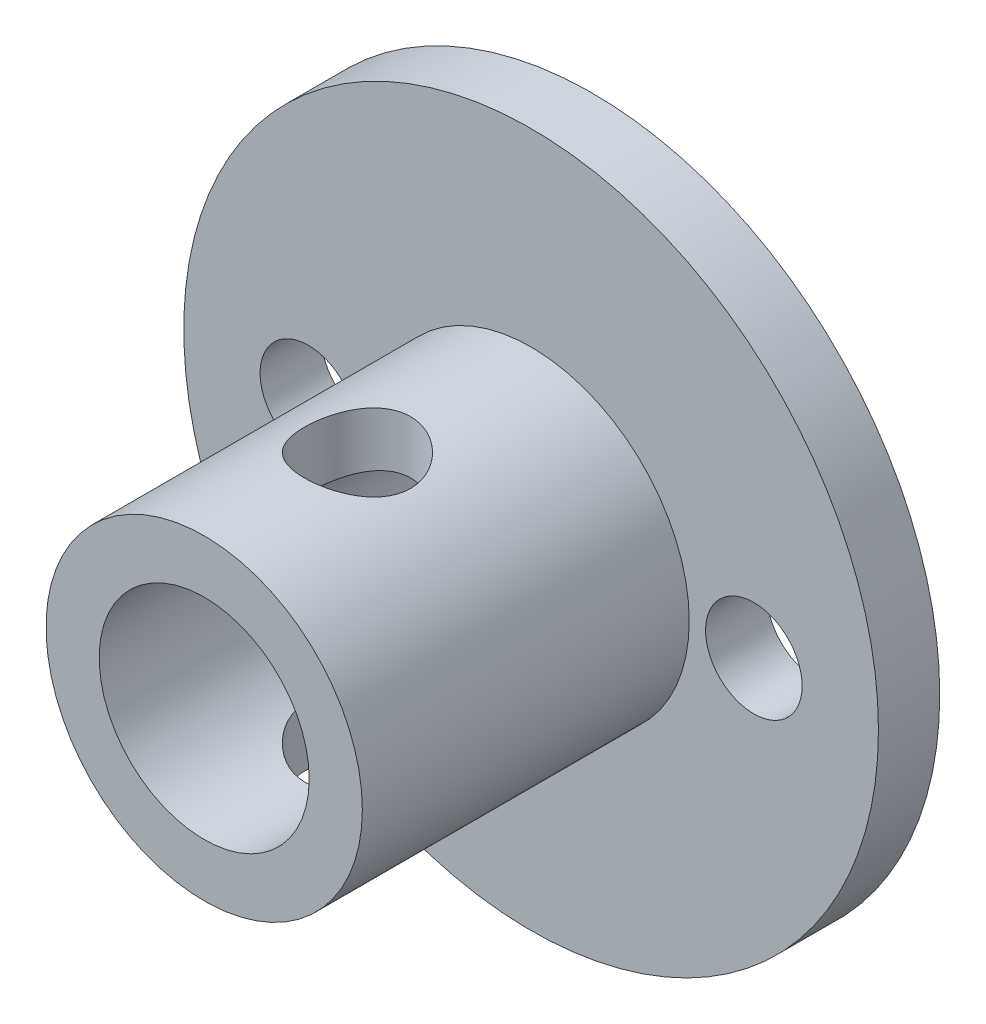
ISO-10303-21;
HEADER;
FILE_DESCRIPTION(('STEP AP214'),'2;1');
FILE_NAME('part.step','',(''),(''),'','','');
FILE_SCHEMA(('AUTOMOTIVE_DESIGN { 1 0 10303 214 1 1 1 1 }'));
ENDSEC;
DATA;
#1=APPLICATION_CONTEXT('core data for automotive mechanical design processes');
#2=APPLICATION_PROTOCOL_DEFINITION('international standard','automotive_design',2000,#1);
#3=PRODUCT_CONTEXT('',#1,'mechanical');
#4=PRODUCT('Part','Part','',(#3));
#5=PRODUCT_RELATED_PRODUCT_CATEGORY('part','',(#4));
#6=PRODUCT_DEFINITION_FORMATION('','',#4);
#7=PRODUCT_DEFINITION_CONTEXT('part definition',#1,'design');
#8=PRODUCT_DEFINITION('design','',#6,#7);
#9=PRODUCT_DEFINITION_SHAPE('','',#8);
#10=(LENGTH_UNIT() NAMED_UNIT(*) SI_UNIT(.MILLI.,.METRE.));
#11=(NAMED_UNIT(*) PLANE_ANGLE_UNIT() SI_UNIT($,.RADIAN.));
#12=(NAMED_UNIT(*) SI_UNIT($,.STERADIAN.) SOLID_ANGLE_UNIT());
#13=UNCERTAINTY_MEASURE_WITH_UNIT(LENGTH_MEASURE(1.E-05),#10,'distance_accuracy_value','');
#14=(GEOMETRIC_REPRESENTATION_CONTEXT(3) GLOBAL_UNCERTAINTY_ASSIGNED_CONTEXT((#13)) GLOBAL_UNIT_ASSIGNED_CONTEXT((#10,
#11,#12)) REPRESENTATION_CONTEXT('',''));
#15=CARTESIAN_POINT('',(0.,0.,0.));
#16=DIRECTION('',(0.,0.,1.));
#17=DIRECTION('',(1.,0.,0.));
#18=AXIS2_PLACEMENT_3D('',#15,#16,#17);
#19=CARTESIAN_POINT('',(0.,0.,0.));
#20=DIRECTION('',(0.,0.,1.));
#21=DIRECTION('',(1.,0.,0.));
#22=AXIS2_PLACEMENT_3D('',#19,#20,#21);
#23=PLANE('',#22);
#24=CARTESIAN_POINT('',(0.,0.,0.));
#25=DIRECTION('',(0.,0.,1.));
#26=DIRECTION('',(1.,0.,0.));
#27=AXIS2_PLACEMENT_3D('',#24,#25,#26);
#28=CIRCLE('',#27,3.2639);
#29=CARTESIAN_POINT('',(3.2639,0.,0.));
#30=VERTEX_POINT('',#29);
#31=EDGE_CURVE('E10',#30,#30,#28,.T.);
#32=ORIENTED_EDGE('',*,*,#31,.T.);
#33=EDGE_LOOP('',(#32));
#34=FACE_BOUND('',#33,.T.);
#35=CARTESIAN_POINT('',(0.,0.,0.));
#36=DIRECTION('',(0.,0.,1.));
#37=DIRECTION('',(1.,0.,0.));
#38=AXIS2_PLACEMENT_3D('',#35,#36,#37);
#39=CIRCLE('',#38,10.795);
#40=CARTESIAN_POINT('',(10.795,0.,0.));
#41=VERTEX_POINT('',#40);
#42=EDGE_CURVE('E57',#41,#41,#39,.T.);
#43=ORIENTED_EDGE('',*,*,#42,.F.);
#44=EDGE_LOOP('',(#43));
#45=FACE_BOUND('',#44,.T.);
#46=CARTESIAN_POINT('',(6.9229,0.,0.));
#47=DIRECTION('',(0.,0.,1.));
#48=DIRECTION('',(1.,0.,0.));
#49=AXIS2_PLACEMENT_3D('',#46,#47,#48);
#50=CIRCLE('',#49,1.5);
#51=CARTESIAN_POINT('',(8.4229,0.,0.));
#52=VERTEX_POINT('',#51);
#53=EDGE_CURVE('E108',#52,#52,#50,.F.);
#54=ORIENTED_EDGE('',*,*,#53,.F.);
#55=EDGE_LOOP('',(#54));
#56=FACE_BOUND('',#55,.T.);
#57=CARTESIAN_POINT('',(-6.9229,0.,0.));
#58=DIRECTION('',(0.,0.,1.));
#59=DIRECTION('',(1.,0.,0.));
#60=AXIS2_PLACEMENT_3D('',#57,#58,#59);
#61=CIRCLE('',#60,1.5);
#62=CARTESIAN_POINT('',(-5.4229,0.,0.));
#63=VERTEX_POINT('',#62);
#64=EDGE_CURVE('E157',#63,#63,#61,.T.);
#65=ORIENTED_EDGE('',*,*,#64,.T.);
#66=EDGE_LOOP('',(#65));
#67=FACE_BOUND('',#66,.T.);
#68=ADVANCED_FACE('F47',(#34,#45,#56,#67),#23,.F.);
#69=CARTESIAN_POINT('',(0.,0.,1.905));
#70=DIRECTION('',(0.,0.,1.));
#71=DIRECTION('',(1.,0.,0.));
#72=AXIS2_PLACEMENT_3D('',#69,#70,#71);
#73=PLANE('',#72);
#74=CARTESIAN_POINT('',(6.9229,0.,1.905));
#75=DIRECTION('',(0.,0.,1.));
#76=DIRECTION('',(1.,0.,0.));
#77=AXIS2_PLACEMENT_3D('',#74,#75,#76);
#78=CIRCLE('',#77,1.5);
#79=CARTESIAN_POINT('',(8.4229,0.,1.905));
#80=VERTEX_POINT('',#79);
#81=EDGE_CURVE('E160',#80,#80,#78,.F.);
#82=ORIENTED_EDGE('',*,*,#81,.T.);
#83=EDGE_LOOP('',(#82));
#84=FACE_BOUND('',#83,.T.);
#85=CARTESIAN_POINT('',(0.,0.,1.905));
#86=DIRECTION('',(0.,0.,1.));
#87=DIRECTION('',(1.,0.,0.));
#88=AXIS2_PLACEMENT_3D('',#85,#86,#87);
#89=CIRCLE('',#88,10.795);
#90=CARTESIAN_POINT('',(10.795,0.,1.905));
#91=VERTEX_POINT('',#90);
#92=EDGE_CURVE('E65',#91,#91,#89,.T.);
#93=ORIENTED_EDGE('',*,*,#92,.T.);
#94=EDGE_LOOP('',(#93));
#95=FACE_BOUND('',#94,.T.);
#96=CARTESIAN_POINT('',(0.,0.,1.905));
#97=DIRECTION('',(0.,0.,1.));
#98=DIRECTION('',(1.,0.,0.));
#99=AXIS2_PLACEMENT_3D('',#96,#97,#98);
#100=CIRCLE('',#99,4.9149);
#101=CARTESIAN_POINT('',(4.9149,0.,1.905));
#102=VERTEX_POINT('',#101);
#103=EDGE_CURVE('E124',#102,#102,#100,.T.);
#104=ORIENTED_EDGE('',*,*,#103,.F.);
#105=EDGE_LOOP('',(#104));
#106=FACE_BOUND('',#105,.T.);
#107=CARTESIAN_POINT('',(-6.9229,0.,1.905));
#108=DIRECTION('',(0.,0.,1.));
#109=DIRECTION('',(1.,0.,0.));
#110=AXIS2_PLACEMENT_3D('',#107,#108,#109);
#111=CIRCLE('',#110,1.5);
#112=CARTESIAN_POINT('',(-5.4229,0.,1.905));
#113=VERTEX_POINT('',#112);
#114=EDGE_CURVE('E52',#113,#113,#111,.T.);
#115=ORIENTED_EDGE('',*,*,#114,.F.);
#116=EDGE_LOOP('',(#115));
#117=FACE_BOUND('',#116,.T.);
#118=ADVANCED_FACE('F132',(#84,#95,#106,#117),#73,.T.);
#119=CARTESIAN_POINT('',(0.,0.,9.57683886873778));
#120=DIRECTION('',(0.,0.,1.));
#121=DIRECTION('',(1.,0.,0.));
#122=AXIS2_PLACEMENT_3D('',#119,#120,#121);
#123=CYLINDRICAL_SURFACE('',#122,3.2639);
#124=CARTESIAN_POINT('',(0.,-3.2639,8.9535));
#125=CARTESIAN_POINT('',(-0.0866743161546716,-3.26389518406935,8.95349447936587));
#126=CARTESIAN_POINT('',(-0.173448302633063,-3.26041065493055,8.94663459382227));
#127=CARTESIAN_POINT('',(-0.344423929559193,-3.24681466023131,8.91950208505693));
#128=CARTESIAN_POINT('',(-0.428620538343409,-3.23669100200708,8.89920478356427));
#129=CARTESIAN_POINT('',(-0.591708686725862,-3.21087452330194,8.84619843667215));
#130=CARTESIAN_POINT('',(-0.670619595384266,-3.19520352784332,8.81353799743174));
#131=CARTESIAN_POINT('',(-0.821720461484642,-3.15972322185068,8.73698829742583));
#132=CARTESIAN_POINT('',(-0.893910846848539,-3.13991417506344,8.69309975226551));
#133=CARTESIAN_POINT('',(-1.03451475190874,-3.09654049367507,8.59227436978497));
#134=CARTESIAN_POINT('',(-1.10242303155303,-3.0728198214536,8.53470110786543));
#135=CARTESIAN_POINT('',(-1.2280872049892,-3.02479404722851,8.40951372827445));
#136=CARTESIAN_POINT('',(-1.28583516663715,-3.00048850529746,8.34189184095676));
#137=CARTESIAN_POINT('',(-1.39416717524433,-2.9518035915117,8.19205638998459));
#138=CARTESIAN_POINT('',(-1.4438110416163,-2.92757328300694,8.10910885360747));
#139=CARTESIAN_POINT('',(-1.5282346067493,-2.88440723043396,7.93469227529807));
#140=CARTESIAN_POINT('',(-1.56302510057995,-2.86546764466991,7.84322948113816));
#141=CARTESIAN_POINT('',(-1.61446114310498,-2.83679119121667,7.66000279698426));
#142=CARTESIAN_POINT('',(-1.63207633130595,-2.82656727339196,7.56859125771947));
#143=CARTESIAN_POINT('',(-1.65162153655927,-2.8151967345039,7.38358644022215));
#144=CARTESIAN_POINT('',(-1.65356772347976,-2.81404075567235,7.2899955111318));
#145=CARTESIAN_POINT('',(-1.642430196134,-2.82054676053307,7.1156848240395));
#146=CARTESIAN_POINT('',(-1.63116730940819,-2.82714068908936,7.03479896210846));
#147=CARTESIAN_POINT('',(-1.59709349148151,-2.84652700081751,6.87627294141149));
#148=CARTESIAN_POINT('',(-1.57427873366078,-2.85932143788115,6.79863386739365));
#149=CARTESIAN_POINT('',(-1.51734211506637,-2.88994403948397,6.64658672274747));
#150=CARTESIAN_POINT('',(-1.48296987386942,-2.90788224535023,6.57229562362262));
#151=CARTESIAN_POINT('',(-1.4040880760569,-2.94677993382483,6.43017500075879));
#152=CARTESIAN_POINT('',(-1.35957396197616,-2.96774077315832,6.36234840147393));
#153=CARTESIAN_POINT('',(-1.25491814440528,-3.01361786075781,6.22578642692257));
#154=CARTESIAN_POINT('',(-1.19349641494523,-3.03869380447208,6.1580821915968));
#155=CARTESIAN_POINT('',(-1.06008231218159,-3.08776975671443,6.03349970872871));
#156=CARTESIAN_POINT('',(-0.9880846894936,-3.11176922316212,5.97662686977178));
#157=CARTESIAN_POINT('',(-0.831142944886163,-3.15740916532177,5.87271822554476));
#158=CARTESIAN_POINT('',(-0.745739914897902,-3.17887849454948,5.82629422150973));
#159=CARTESIAN_POINT('',(-0.566976246490867,-3.21556824951897,5.74885754619822));
#160=CARTESIAN_POINT('',(-0.473622137513596,-3.230793744082,5.71783236964486));
#161=CARTESIAN_POINT('',(-0.29002271649704,-3.25219047317816,5.67467347579408));
#162=CARTESIAN_POINT('',(-0.200176303058313,-3.25901552135411,5.66117034318939));
#163=CARTESIAN_POINT('',(-0.0192473518612322,-3.26509561460058,5.64912826365375));
#164=CARTESIAN_POINT('',(0.0718345575991038,-3.264354373188,5.65058197594174));
#165=CARTESIAN_POINT('',(0.244921165039386,-3.25575970010752,5.6676384171677));
#166=CARTESIAN_POINT('',(0.327070564923841,-3.24847807257193,5.68210372990394));
#167=CARTESIAN_POINT('',(0.487604879226852,-3.22828630185017,5.72297315832178));
#168=CARTESIAN_POINT('',(0.565989381895258,-3.21537554457997,5.74937857656596));
#169=CARTESIAN_POINT('',(0.719324714023555,-3.18463582293724,5.81404663357221));
#170=CARTESIAN_POINT('',(0.794117384201571,-3.16667896918384,5.85262131885665));
#171=CARTESIAN_POINT('',(0.93641086866838,-3.12756004863741,5.940177413053));
#172=CARTESIAN_POINT('',(1.0039085930804,-3.10639663270505,5.9891632058783));
#173=CARTESIAN_POINT('',(1.13685347637114,-3.06039792647843,6.10179413736397));
#174=CARTESIAN_POINT('',(1.20142156462652,-3.03540704824268,6.16641505124659));
#175=CARTESIAN_POINT('',(1.31920399157056,-2.98610602366349,6.30559389974865));
#176=CARTESIAN_POINT('',(1.37241001868448,-2.96179638687841,6.3801590444383));
#177=CARTESIAN_POINT('',(1.46855413339212,-2.91537156896778,6.54194214152715));
#178=CARTESIAN_POINT('',(1.51082170876128,-2.89343405586067,6.62961413670044));
#179=CARTESIAN_POINT('',(1.57955134044269,-2.85650222374616,6.8122872050667));
#180=CARTESIAN_POINT('',(1.60603421242382,-2.84149876652621,6.90727843857641));
#181=CARTESIAN_POINT('',(1.63996316276487,-2.82204049642388,7.09208469069062));
#182=CARTESIAN_POINT('',(1.64900193023019,-2.81670621680175,7.18151249949953));
#183=CARTESIAN_POINT('',(1.65240156461376,-2.81471525550708,7.3607262562989));
#184=CARTESIAN_POINT('',(1.64676931107214,-2.81805450663747,7.45051201672399));
#185=CARTESIAN_POINT('',(1.62248419636194,-2.83209242485164,7.61845052143559));
#186=CARTESIAN_POINT('',(1.60518388809696,-2.84202506606309,7.696871301256));
#187=CARTESIAN_POINT('',(1.55975414641033,-2.86720781370657,7.84960160864116));
#188=CARTESIAN_POINT('',(1.5316211612457,-2.88245966400924,7.92390977864297));
#189=CARTESIAN_POINT('',(1.46322243682689,-2.91780671148831,8.07182534486905));
#190=CARTESIAN_POINT('',(1.42227006607371,-2.93815795603473,8.14505218680811));
#191=CARTESIAN_POINT('',(1.33013952612732,-2.98099859501298,8.28407649395812));
#192=CARTESIAN_POINT('',(1.27895597485656,-3.00348911152383,8.34987002026581));
#193=CARTESIAN_POINT('',(1.16029421730556,-3.05144993941929,8.4807468621776));
#194=CARTESIAN_POINT('',(1.09157744791209,-3.07694018627625,8.54470609077349));
#195=CARTESIAN_POINT('',(0.943704164548248,-3.12546270366633,8.66045404949103));
#196=CARTESIAN_POINT('',(0.864541897411261,-3.148493606903,8.71223602858411));
#197=CARTESIAN_POINT('',(0.696692113793637,-3.18985963781234,8.80236071209797));
#198=CARTESIAN_POINT('',(0.607919539233306,-3.20814697767614,8.8405679817043));
#199=CARTESIAN_POINT('',(0.424114001879223,-3.23755546068044,8.90100834107745));
#200=CARTESIAN_POINT('',(0.329099496450083,-3.24869676849706,8.92328640049647));
#201=CARTESIAN_POINT('',(0.194230704234056,-3.25834676745851,8.94249886910294));
#202=CARTESIAN_POINT('',(0.155536153712193,-3.26042351631051,8.94661815615893));
#203=CARTESIAN_POINT('',(0.0779011195646386,-3.26320123373848,8.95211999970893));
#204=CARTESIAN_POINT('',(0.0389606292601653,-3.26390216478995,8.95350248155843));
#205=CARTESIAN_POINT('',(0.,-3.2639,8.9535));
#206=B_SPLINE_CURVE_WITH_KNOTS('',3,(#124,#125,#126,#127,#128,#129,#130,#131,#132,#133,#134,
#135,#136,#137,#138,#139,#140,#141,#142,#143,#144,#145,#146,#147,#148,#149,#150,#151,#152,#153,
#154,#155,#156,#157,#158,#159,#160,#161,#162,#163,#164,#165,#166,#167,#168,#169,#170,#171,#172,
#173,#174,#175,#176,#177,#178,#179,#180,#181,#182,#183,#184,#185,#186,#187,#188,#189,#190,#191,
#192,#193,#194,#195,#196,#197,#198,#199,#200,#201,#202,#203,#204,#205),.UNSPECIFIED.,.T.,.F.,(4,
2,2,2,2,2,2,2,2,2,2,2,2,2,2,2,2,2,2,2,2,2,2,2,2,2,2,2,2,2,2,2,2,2,2,2,2,2,2,2,4),(0.,
0.259865028619913,0.520208637069391,0.779539149850236,1.0388531387358,1.31411331368816,
1.58958743937332,1.88705716020355,2.18431031772651,2.46359646071609,2.74259435306229,
2.98724494997117,3.23197664178694,3.48239411990317,3.7329243511407,4.01606858376627,
4.29935383398231,4.59639549966106,4.89319554363307,5.16503299418204,5.43673703397555,
5.68677671180337,5.93684367338763,6.193930492528,6.45112578113109,6.73402466362833,
7.01712978873168,7.31482557044075,7.61212789994223,7.8806924259888,8.14913103934022,
8.39083644050084,8.632621157926,8.8906062015466,9.14872731616705,9.43922300972631,
9.72987937549201,10.0233591663241,10.3160071294481,10.4328148454963,10.5496257473519),.UNSPECIFIED.);
#207=CARTESIAN_POINT('',(0.,-3.2639,8.9535));
#208=VERTEX_POINT('',#207);
#209=EDGE_CURVE('E107',#208,#208,#206,.T.);
#210=ORIENTED_EDGE('',*,*,#209,.T.);
#211=EDGE_LOOP('',(#210));
#212=FACE_BOUND('',#211,.T.);
#213=CARTESIAN_POINT('',(0.,3.2639,8.9535));
#214=CARTESIAN_POINT('',(0.0866743161546716,3.26389518406935,8.95349447936587));
#215=CARTESIAN_POINT('',(0.173448302633063,3.26041065493055,8.94663459382227));
#216=CARTESIAN_POINT('',(0.344423929559193,3.24681466023131,8.91950208505693));
#217=CARTESIAN_POINT('',(0.428620538343409,3.23669100200708,8.89920478356427));
#218=CARTESIAN_POINT('',(0.591708686725862,3.21087452330194,8.84619843667215));
#219=CARTESIAN_POINT('',(0.670619595384266,3.19520352784332,8.81353799743174));
#220=CARTESIAN_POINT('',(0.821720461484642,3.15972322185068,8.73698829742583));
#221=CARTESIAN_POINT('',(0.893910846848539,3.13991417506344,8.69309975226551));
#222=CARTESIAN_POINT('',(1.03451475190874,3.09654049367507,8.59227436978497));
#223=CARTESIAN_POINT('',(1.10242303155303,3.0728198214536,8.53470110786543));
#224=CARTESIAN_POINT('',(1.2280872049892,3.02479404722851,8.40951372827445));
#225=CARTESIAN_POINT('',(1.28583516663715,3.00048850529746,8.34189184095676));
#226=CARTESIAN_POINT('',(1.39416717524433,2.9518035915117,8.19205638998459));
#227=CARTESIAN_POINT('',(1.4438110416163,2.92757328300694,8.10910885360747));
#228=CARTESIAN_POINT('',(1.5282346067493,2.88440723043396,7.93469227529807));
#229=CARTESIAN_POINT('',(1.56302510057995,2.86546764466991,7.84322948113816));
#230=CARTESIAN_POINT('',(1.61446114310498,2.83679119121667,7.66000279698426));
#231=CARTESIAN_POINT('',(1.63207633130595,2.82656727339196,7.56859125771947));
#232=CARTESIAN_POINT('',(1.65162153655927,2.8151967345039,7.38358644022215));
#233=CARTESIAN_POINT('',(1.65356772347976,2.81404075567235,7.2899955111318));
#234=CARTESIAN_POINT('',(1.642430196134,2.82054676053307,7.1156848240395));
#235=CARTESIAN_POINT('',(1.63116730940819,2.82714068908936,7.03479896210846));
#236=CARTESIAN_POINT('',(1.59709349148151,2.84652700081751,6.87627294141149));
#237=CARTESIAN_POINT('',(1.57427873366078,2.85932143788115,6.79863386739365));
#238=CARTESIAN_POINT('',(1.51734211506637,2.88994403948397,6.64658672274747));
#239=CARTESIAN_POINT('',(1.48296987386942,2.90788224535023,6.57229562362262));
#240=CARTESIAN_POINT('',(1.4040880760569,2.94677993382483,6.43017500075879));
#241=CARTESIAN_POINT('',(1.35957396197616,2.96774077315832,6.36234840147393));
#242=CARTESIAN_POINT('',(1.25491814440528,3.01361786075781,6.22578642692257));
#243=CARTESIAN_POINT('',(1.19349641494523,3.03869380447208,6.1580821915968));
#244=CARTESIAN_POINT('',(1.06008231218159,3.08776975671443,6.03349970872871));
#245=CARTESIAN_POINT('',(0.9880846894936,3.11176922316212,5.97662686977178));
#246=CARTESIAN_POINT('',(0.831142944886163,3.15740916532177,5.87271822554476));
#247=CARTESIAN_POINT('',(0.745739914897902,3.17887849454948,5.82629422150973));
#248=CARTESIAN_POINT('',(0.566976246490867,3.21556824951897,5.74885754619822));
#249=CARTESIAN_POINT('',(0.473622137513596,3.230793744082,5.71783236964486));
#250=CARTESIAN_POINT('',(0.29002271649704,3.25219047317816,5.67467347579408));
#251=CARTESIAN_POINT('',(0.200176303058313,3.25901552135411,5.66117034318939));
#252=CARTESIAN_POINT('',(0.0192473518612322,3.26509561460058,5.64912826365375));
#253=CARTESIAN_POINT('',(-0.0718345575991038,3.264354373188,5.65058197594174));
#254=CARTESIAN_POINT('',(-0.244921165039386,3.25575970010752,5.6676384171677));
#255=CARTESIAN_POINT('',(-0.327070564923841,3.24847807257193,5.68210372990394));
#256=CARTESIAN_POINT('',(-0.487604879226852,3.22828630185017,5.72297315832178));
#257=CARTESIAN_POINT('',(-0.565989381895258,3.21537554457997,5.74937857656596));
#258=CARTESIAN_POINT('',(-0.719324714023555,3.18463582293724,5.81404663357221));
#259=CARTESIAN_POINT('',(-0.794117384201571,3.16667896918384,5.85262131885665));
#260=CARTESIAN_POINT('',(-0.93641086866838,3.12756004863741,5.940177413053));
#261=CARTESIAN_POINT('',(-1.0039085930804,3.10639663270505,5.9891632058783));
#262=CARTESIAN_POINT('',(-1.13685347637114,3.06039792647843,6.10179413736397));
#263=CARTESIAN_POINT('',(-1.20142156462652,3.03540704824268,6.16641505124659));
#264=CARTESIAN_POINT('',(-1.31920399157056,2.98610602366349,6.30559389974865));
#265=CARTESIAN_POINT('',(-1.37241001868448,2.96179638687841,6.3801590444383));
#266=CARTESIAN_POINT('',(-1.46855413339212,2.91537156896778,6.54194214152715));
#267=CARTESIAN_POINT('',(-1.51082170876128,2.89343405586067,6.62961413670044));
#268=CARTESIAN_POINT('',(-1.57955134044269,2.85650222374616,6.8122872050667));
#269=CARTESIAN_POINT('',(-1.60603421242382,2.84149876652621,6.90727843857641));
#270=CARTESIAN_POINT('',(-1.63996316276487,2.82204049642388,7.09208469069062));
#271=CARTESIAN_POINT('',(-1.64900193023019,2.81670621680175,7.18151249949953));
#272=CARTESIAN_POINT('',(-1.65240156461376,2.81471525550708,7.3607262562989));
#273=CARTESIAN_POINT('',(-1.64676931107214,2.81805450663747,7.45051201672399));
#274=CARTESIAN_POINT('',(-1.62248419636194,2.83209242485164,7.61845052143559));
#275=CARTESIAN_POINT('',(-1.60518388809696,2.84202506606309,7.696871301256));
#276=CARTESIAN_POINT('',(-1.55975414641033,2.86720781370657,7.84960160864116));
#277=CARTESIAN_POINT('',(-1.5316211612457,2.88245966400924,7.92390977864297));
#278=CARTESIAN_POINT('',(-1.46322243682689,2.91780671148831,8.07182534486905));
#279=CARTESIAN_POINT('',(-1.42227006607371,2.93815795603473,8.14505218680811));
#280=CARTESIAN_POINT('',(-1.33013952612732,2.98099859501298,8.28407649395812));
#281=CARTESIAN_POINT('',(-1.27895597485656,3.00348911152383,8.34987002026581));
#282=CARTESIAN_POINT('',(-1.16029421730556,3.05144993941929,8.4807468621776));
#283=CARTESIAN_POINT('',(-1.09157744791209,3.07694018627625,8.54470609077349));
#284=CARTESIAN_POINT('',(-0.943704164548248,3.12546270366633,8.66045404949103));
#285=CARTESIAN_POINT('',(-0.864541897411261,3.148493606903,8.71223602858411));
#286=CARTESIAN_POINT('',(-0.696692113793637,3.18985963781234,8.80236071209797));
#287=CARTESIAN_POINT('',(-0.607919539233306,3.20814697767614,8.8405679817043));
#288=CARTESIAN_POINT('',(-0.424114001879223,3.23755546068044,8.90100834107745));
#289=CARTESIAN_POINT('',(-0.329099496450083,3.24869676849706,8.92328640049647));
#290=CARTESIAN_POINT('',(-0.194230704234056,3.25834676745851,8.94249886910294));
#291=CARTESIAN_POINT('',(-0.155536153712193,3.26042351631051,8.94661815615893));
#292=CARTESIAN_POINT('',(-0.0779011195646386,3.26320123373848,8.95211999970893));
#293=CARTESIAN_POINT('',(-0.0389606292601653,3.26390216478995,8.95350248155843));
#294=CARTESIAN_POINT('',(0.,3.2639,8.9535));
#295=B_SPLINE_CURVE_WITH_KNOTS('',3,(#213,#214,#215,#216,#217,#218,#219,#220,#221,#222,#223,
#224,#225,#226,#227,#228,#229,#230,#231,#232,#233,#234,#235,#236,#237,#238,#239,#240,#241,#242,
#243,#244,#245,#246,#247,#248,#249,#250,#251,#252,#253,#254,#255,#256,#257,#258,#259,#260,#261,
#262,#263,#264,#265,#266,#267,#268,#269,#270,#271,#272,#273,#274,#275,#276,#277,#278,#279,#280,
#281,#282,#283,#284,#285,#286,#287,#288,#289,#290,#291,#292,#293,#294),.UNSPECIFIED.,.T.,.F.,(4,
2,2,2,2,2,2,2,2,2,2,2,2,2,2,2,2,2,2,2,2,2,2,2,2,2,2,2,2,2,2,2,2,2,2,2,2,2,2,2,4),(0.,
0.259865028619913,0.520208637069391,0.779539149850236,1.0388531387358,1.31411331368816,
1.58958743937332,1.88705716020355,2.18431031772651,2.46359646071609,2.74259435306229,
2.98724494997117,3.23197664178694,3.48239411990317,3.7329243511407,4.01606858376627,
4.29935383398231,4.59639549966106,4.89319554363307,5.16503299418204,5.43673703397555,
5.68677671180337,5.93684367338763,6.193930492528,6.45112578113109,6.73402466362833,
7.01712978873168,7.31482557044075,7.61212789994223,7.8806924259888,8.14913103934022,
8.39083644050084,8.632621157926,8.8906062015466,9.14872731616705,9.43922300972631,
9.72987937549201,10.0233591663241,10.3160071294481,10.4328148454963,10.5496257473519),.UNSPECIFIED.);
#296=CARTESIAN_POINT('',(0.,3.2639,8.9535));
#297=VERTEX_POINT('',#296);
#298=EDGE_CURVE('E100',#297,#297,#295,.T.);
#299=ORIENTED_EDGE('',*,*,#298,.T.);
#300=EDGE_LOOP('',(#299));
#301=FACE_BOUND('',#300,.T.);
#302=ORIENTED_EDGE('',*,*,#31,.F.);
#303=EDGE_LOOP('',(#302));
#304=FACE_BOUND('',#303,.T.);
#305=CARTESIAN_POINT('',(0.,0.,12.065));
#306=DIRECTION('',(0.,0.,1.));
#307=DIRECTION('',(1.,0.,0.));
#308=AXIS2_PLACEMENT_3D('',#305,#306,#307);
#309=CIRCLE('',#308,3.2639);
#310=CARTESIAN_POINT('',(3.2639,0.,12.065));
#311=VERTEX_POINT('',#310);
#312=EDGE_CURVE('E116',#311,#311,#309,.T.);
#313=ORIENTED_EDGE('',*,*,#312,.T.);
#314=EDGE_LOOP('',(#313));
#315=FACE_BOUND('',#314,.T.);
#316=ADVANCED_FACE('F49',(#212,#301,#304,#315),#123,.F.);
#317=CARTESIAN_POINT('',(0.,0.,9.57683886873778));
#318=DIRECTION('',(0.,0.,1.));
#319=DIRECTION('',(1.,0.,0.));
#320=AXIS2_PLACEMENT_3D('',#317,#318,#319);
#321=CYLINDRICAL_SURFACE('',#320,10.795);
#322=ORIENTED_EDGE('',*,*,#42,.T.);
#323=EDGE_LOOP('',(#322));
#324=FACE_BOUND('',#323,.T.);
#325=ORIENTED_EDGE('',*,*,#92,.F.);
#326=EDGE_LOOP('',(#325));
#327=FACE_BOUND('',#326,.T.);
#328=ADVANCED_FACE('F135',(#324,#327),#321,.T.);
#329=CARTESIAN_POINT('',(0.,0.,9.57683886873778));
#330=DIRECTION('',(0.,0.,1.));
#331=DIRECTION('',(1.,0.,0.));
#332=AXIS2_PLACEMENT_3D('',#329,#330,#331);
#333=CYLINDRICAL_SURFACE('',#332,4.9149);
#334=CARTESIAN_POINT('',(0.,-4.9149,8.9535));
#335=CARTESIAN_POINT('',(-0.0900444209638633,-4.91490035501568,8.95350055970076));
#336=CARTESIAN_POINT('',(-0.180085188884433,-4.91240274111522,8.9461096425922));
#337=CARTESIAN_POINT('',(-0.357512227458551,-4.90268549381262,8.91683342294808));
#338=CARTESIAN_POINT('',(-0.444898262592078,-4.89546544272264,8.89494683830457));
#339=CARTESIAN_POINT('',(-0.61443231462248,-4.87708728226227,8.8375158297974));
#340=CARTESIAN_POINT('',(-0.696588898059436,-4.86593581987277,8.80199444983607));
#341=CARTESIAN_POINT('',(-0.853778088449677,-4.84083142011874,8.71840710208715));
#342=CARTESIAN_POINT('',(-0.928809251915254,-4.8268779168845,8.6703385998302));
#343=CARTESIAN_POINT('',(-1.07225185642978,-4.79708841713242,8.56124974272895));
#344=CARTESIAN_POINT('',(-1.14037867125755,-4.78120682149435,8.49986765523506));
#345=CARTESIAN_POINT('',(-1.26558952005463,-4.74960033772518,8.36666303515188));
#346=CARTESIAN_POINT('',(-1.32267107133522,-4.73387548557757,8.29483816163454));
#347=CARTESIAN_POINT('',(-1.42580647481294,-4.70385952271541,8.14021160726291));
#348=CARTESIAN_POINT('',(-1.4714884598976,-4.68962387954842,8.05715008389197));
#349=CARTESIAN_POINT('',(-1.54811296429794,-4.66489242459702,7.88396789119744));
#350=CARTESIAN_POINT('',(-1.57906006165344,-4.65439545148632,7.79384942456944));
#351=CARTESIAN_POINT('',(-1.62426521806392,-4.63881042572278,7.61235079102322));
#352=CARTESIAN_POINT('',(-1.6390572412966,-4.63354986009341,7.52111887282644));
#353=CARTESIAN_POINT('',(-1.65320165760529,-4.62852330843629,7.33732805694522));
#354=CARTESIAN_POINT('',(-1.65255891006397,-4.628755593075,7.24476958607557));
#355=CARTESIAN_POINT('',(-1.63626624134474,-4.63453745887633,7.0655255881555));
#356=CARTESIAN_POINT('',(-1.62131560059377,-4.63983926326995,6.97876711413232));
#357=CARTESIAN_POINT('',(-1.57797320084153,-4.65475697449289,6.80907001003239));
#358=CARTESIAN_POINT('',(-1.5495798090729,-4.66437340537278,6.72613184531662));
#359=CARTESIAN_POINT('',(-1.47970463168114,-4.68701172815252,6.56485069971093));
#360=CARTESIAN_POINT('',(-1.43801720914704,-4.70008653338513,6.4866045601173));
#361=CARTESIAN_POINT('',(-1.34288009656001,-4.7281465042825,6.33799824321898));
#362=CARTESIAN_POINT('',(-1.28942696679887,-4.74313222806482,6.26764038115259));
#363=CARTESIAN_POINT('',(-1.16892670781728,-4.77429782194741,6.13288171847892));
#364=CARTESIAN_POINT('',(-1.10130866207889,-4.79049885774076,6.06899526708717));
#365=CARTESIAN_POINT('',(-0.956119881006606,-4.82157458293075,5.95333328842555));
#366=CARTESIAN_POINT('',(-0.878548162342834,-4.83644914103738,5.90155895914875));
#367=CARTESIAN_POINT('',(-0.714550200526478,-4.86339653606534,5.81116815810335));
#368=CARTESIAN_POINT('',(-0.628041625166354,-4.87543921088838,5.77269145241861));
#369=CARTESIAN_POINT('',(-0.449278158399987,-4.89514675602014,5.71099694998654));
#370=CARTESIAN_POINT('',(-0.357025308134816,-4.90281317163158,5.68777376662473));
#371=CARTESIAN_POINT('',(-0.17374485911289,-4.91264748150579,5.65816129578619));
#372=CARTESIAN_POINT('',(-0.0828415522916582,-4.91504218939484,5.65107713280712));
#373=CARTESIAN_POINT('',(0.0988742456947049,-4.91474473577834,5.65196179022311));
#374=CARTESIAN_POINT('',(0.189686749778145,-4.91205344805902,5.65992802492376));
#375=CARTESIAN_POINT('',(0.365848963807207,-4.90203614277453,5.69013864878528));
#376=CARTESIAN_POINT('',(0.451280797007397,-4.89484921060236,5.71195484202617));
#377=CARTESIAN_POINT('',(0.617235961224406,-4.87670337738752,5.76870907839232));
#378=CARTESIAN_POINT('',(0.697758662964449,-4.86574399396504,5.80364879966294));
#379=CARTESIAN_POINT('',(0.853991517218943,-4.84080245584853,5.88668469948008));
#380=CARTESIAN_POINT('',(0.929517344939534,-4.82674782803323,5.9351052928588));
#381=CARTESIAN_POINT('',(1.07159677829021,-4.79720719636361,6.04334825432517));
#382=CARTESIAN_POINT('',(1.13814759523785,-4.78172075012777,6.10317415235462));
#383=CARTESIAN_POINT('',(1.26358747053402,-4.75015449524941,6.23579640454186));
#384=CARTESIAN_POINT('',(1.32198075516842,-4.7340803131018,6.30906416516958));
#385=CARTESIAN_POINT('',(1.42570698550543,-4.70388451626063,6.46470234897491));
#386=CARTESIAN_POINT('',(1.471039774163,-4.68976292504693,6.5470728815917));
#387=CARTESIAN_POINT('',(1.54715948464628,-4.66520587472306,6.71864474529953));
#388=CARTESIAN_POINT('',(1.57797172328666,-4.65476400803318,6.80783387004575));
#389=CARTESIAN_POINT('',(1.62399691040133,-4.63890937217455,6.99056779312616));
#390=CARTESIAN_POINT('',(1.63921703157983,-4.63349429068586,7.08411056796615));
#391=CARTESIAN_POINT('',(1.65306125088087,-4.62857201272645,7.2676471961579));
#392=CARTESIAN_POINT('',(1.65250950927508,-4.62877142187673,7.35757169550546));
#393=CARTESIAN_POINT('',(1.63685893960285,-4.63432866652353,7.53597502110676));
#394=CARTESIAN_POINT('',(1.62176100325862,-4.63968618581355,7.62445393564075));
#395=CARTESIAN_POINT('',(1.57803378725046,-4.65473590032124,7.79572712737423));
#396=CARTESIAN_POINT('',(1.54967542760875,-4.66434110810051,7.87859881859897));
#397=CARTESIAN_POINT('',(1.4804528478786,-4.68677062665792,8.03847078167711));
#398=CARTESIAN_POINT('',(1.4395858248998,-4.69959565880528,8.1154697327553));
#399=CARTESIAN_POINT('',(1.34439919039923,-4.72772630734704,8.26509950881512));
#400=CARTESIAN_POINT('',(1.2895648763578,-4.74311650152211,8.33738690530173));
#401=CARTESIAN_POINT('',(1.1688659025252,-4.77429313253742,8.4720001086984));
#402=CARTESIAN_POINT('',(1.10299810147876,-4.79007968112934,8.53432306880989));
#403=CARTESIAN_POINT('',(0.958953626982534,-4.82102486709261,8.64974105640236));
#404=CARTESIAN_POINT('',(0.880391300386307,-4.83613348112736,8.70236989476535));
#405=CARTESIAN_POINT('',(0.715035216843361,-4.86332950792997,8.79361924924072));
#406=CARTESIAN_POINT('',(0.628243419885651,-4.87541763759704,8.8322430903637));
#407=CARTESIAN_POINT('',(0.452413862043425,-4.89480041857945,8.89291683972689));
#408=CARTESIAN_POINT('',(0.363600675948913,-4.90226573819348,8.91556181217146));
#409=CARTESIAN_POINT('',(0.183189862116424,-4.91231464782891,8.94585095506057));
#410=CARTESIAN_POINT('',(0.0915930411697983,-4.91489963887862,8.95349943067329));
#411=CARTESIAN_POINT('',(0.,-4.9149,8.9535));
#412=B_SPLINE_CURVE_WITH_KNOTS('',3,(#334,#335,#336,#337,#338,#339,#340,#341,#342,#343,#344,
#345,#346,#347,#348,#349,#350,#351,#352,#353,#354,#355,#356,#357,#358,#359,#360,#361,#362,#363,
#364,#365,#366,#367,#368,#369,#370,#371,#372,#373,#374,#375,#376,#377,#378,#379,#380,#381,#382,
#383,#384,#385,#386,#387,#388,#389,#390,#391,#392,#393,#394,#395,#396,#397,#398,#399,#400,#401,
#402,#403,#404,#405,#406,#407,#408,#409,#410,#411),.UNSPECIFIED.,.T.,.F.,(4,2,2,2,2,2,2,2,2,2,2,
2,2,2,2,2,2,2,2,2,2,2,2,2,2,2,2,2,2,2,2,2,2,2,2,2,2,2,4),(0.,0.269796158060384,
0.539616182148262,0.808982182344125,1.07840263557561,1.35634909921353,1.63435796561765,
1.92050768648294,2.2065684442659,2.48285777931023,2.75906013036124,3.0224180258643,
3.28580791723918,3.553487597597,3.82124563837848,4.10321460217987,4.38521144335757,
4.67008801167785,4.95486392479025,5.22712617469961,5.49934165355521,5.76352570990479,
6.02774355977922,6.29897031500325,6.57028115159115,6.85412167149308,7.13796560427356,
7.42131280268674,7.70452959677784,7.97297530179857,8.24140455139796,8.50457438058231,
8.767803223015,9.04266510990718,9.31760538393166,9.60349206573241,9.88931082894731,
10.1638258688057,10.4382620898193),.UNSPECIFIED.);
#413=CARTESIAN_POINT('',(0.,-4.9149,8.9535));
#414=VERTEX_POINT('',#413);
#415=EDGE_CURVE('E78',#414,#414,#412,.T.);
#416=ORIENTED_EDGE('',*,*,#415,.F.);
#417=EDGE_LOOP('',(#416));
#418=FACE_BOUND('',#417,.T.);
#419=CARTESIAN_POINT('',(0.,4.9149,8.9535));
#420=CARTESIAN_POINT('',(0.0900444209638633,4.91490035501568,8.95350055970076));
#421=CARTESIAN_POINT('',(0.180085188884433,4.91240274111522,8.9461096425922));
#422=CARTESIAN_POINT('',(0.357512227458551,4.90268549381262,8.91683342294808));
#423=CARTESIAN_POINT('',(0.444898262592078,4.89546544272264,8.89494683830457));
#424=CARTESIAN_POINT('',(0.61443231462248,4.87708728226227,8.8375158297974));
#425=CARTESIAN_POINT('',(0.696588898059436,4.86593581987277,8.80199444983607));
#426=CARTESIAN_POINT('',(0.853778088449677,4.84083142011874,8.71840710208715));
#427=CARTESIAN_POINT('',(0.928809251915254,4.8268779168845,8.6703385998302));
#428=CARTESIAN_POINT('',(1.07225185642978,4.79708841713242,8.56124974272895));
#429=CARTESIAN_POINT('',(1.14037867125755,4.78120682149435,8.49986765523506));
#430=CARTESIAN_POINT('',(1.26558952005463,4.74960033772518,8.36666303515188));
#431=CARTESIAN_POINT('',(1.32267107133522,4.73387548557757,8.29483816163454));
#432=CARTESIAN_POINT('',(1.42580647481294,4.70385952271541,8.14021160726291));
#433=CARTESIAN_POINT('',(1.4714884598976,4.68962387954842,8.05715008389197));
#434=CARTESIAN_POINT('',(1.54811296429794,4.66489242459702,7.88396789119744));
#435=CARTESIAN_POINT('',(1.57906006165344,4.65439545148632,7.79384942456944));
#436=CARTESIAN_POINT('',(1.62426521806392,4.63881042572278,7.61235079102322));
#437=CARTESIAN_POINT('',(1.6390572412966,4.63354986009341,7.52111887282644));
#438=CARTESIAN_POINT('',(1.65320165760529,4.62852330843629,7.33732805694522));
#439=CARTESIAN_POINT('',(1.65255891006397,4.628755593075,7.24476958607557));
#440=CARTESIAN_POINT('',(1.63626624134474,4.63453745887633,7.0655255881555));
#441=CARTESIAN_POINT('',(1.62131560059377,4.63983926326995,6.97876711413232));
#442=CARTESIAN_POINT('',(1.57797320084153,4.65475697449289,6.80907001003239));
#443=CARTESIAN_POINT('',(1.5495798090729,4.66437340537278,6.72613184531662));
#444=CARTESIAN_POINT('',(1.47970463168114,4.68701172815252,6.56485069971093));
#445=CARTESIAN_POINT('',(1.43801720914704,4.70008653338513,6.4866045601173));
#446=CARTESIAN_POINT('',(1.34288009656001,4.7281465042825,6.33799824321898));
#447=CARTESIAN_POINT('',(1.28942696679887,4.74313222806482,6.26764038115259));
#448=CARTESIAN_POINT('',(1.16892670781728,4.77429782194741,6.13288171847892));
#449=CARTESIAN_POINT('',(1.10130866207889,4.79049885774076,6.06899526708717));
#450=CARTESIAN_POINT('',(0.956119881006606,4.82157458293075,5.95333328842555));
#451=CARTESIAN_POINT('',(0.878548162342834,4.83644914103738,5.90155895914875));
#452=CARTESIAN_POINT('',(0.714550200526478,4.86339653606534,5.81116815810335));
#453=CARTESIAN_POINT('',(0.628041625166354,4.87543921088838,5.77269145241861));
#454=CARTESIAN_POINT('',(0.449278158399987,4.89514675602014,5.71099694998654));
#455=CARTESIAN_POINT('',(0.357025308134816,4.90281317163158,5.68777376662473));
#456=CARTESIAN_POINT('',(0.17374485911289,4.91264748150579,5.65816129578619));
#457=CARTESIAN_POINT('',(0.0828415522916582,4.91504218939484,5.65107713280712));
#458=CARTESIAN_POINT('',(-0.0988742456947049,4.91474473577834,5.65196179022311));
#459=CARTESIAN_POINT('',(-0.189686749778145,4.91205344805902,5.65992802492376));
#460=CARTESIAN_POINT('',(-0.365848963807207,4.90203614277453,5.69013864878528));
#461=CARTESIAN_POINT('',(-0.451280797007397,4.89484921060236,5.71195484202617));
#462=CARTESIAN_POINT('',(-0.617235961224406,4.87670337738752,5.76870907839232));
#463=CARTESIAN_POINT('',(-0.697758662964449,4.86574399396504,5.80364879966294));
#464=CARTESIAN_POINT('',(-0.853991517218943,4.84080245584853,5.88668469948008));
#465=CARTESIAN_POINT('',(-0.929517344939534,4.82674782803323,5.9351052928588));
#466=CARTESIAN_POINT('',(-1.07159677829021,4.79720719636361,6.04334825432517));
#467=CARTESIAN_POINT('',(-1.13814759523785,4.78172075012777,6.10317415235462));
#468=CARTESIAN_POINT('',(-1.26358747053402,4.75015449524941,6.23579640454186));
#469=CARTESIAN_POINT('',(-1.32198075516842,4.7340803131018,6.30906416516958));
#470=CARTESIAN_POINT('',(-1.42570698550543,4.70388451626063,6.46470234897491));
#471=CARTESIAN_POINT('',(-1.471039774163,4.68976292504693,6.5470728815917));
#472=CARTESIAN_POINT('',(-1.54715948464628,4.66520587472306,6.71864474529953));
#473=CARTESIAN_POINT('',(-1.57797172328666,4.65476400803318,6.80783387004575));
#474=CARTESIAN_POINT('',(-1.62399691040133,4.63890937217455,6.99056779312616));
#475=CARTESIAN_POINT('',(-1.63921703157983,4.63349429068586,7.08411056796615));
#476=CARTESIAN_POINT('',(-1.65306125088087,4.62857201272645,7.2676471961579));
#477=CARTESIAN_POINT('',(-1.65250950927508,4.62877142187673,7.35757169550546));
#478=CARTESIAN_POINT('',(-1.63685893960285,4.63432866652353,7.53597502110676));
#479=CARTESIAN_POINT('',(-1.62176100325862,4.63968618581355,7.62445393564075));
#480=CARTESIAN_POINT('',(-1.57803378725046,4.65473590032124,7.79572712737423));
#481=CARTESIAN_POINT('',(-1.54967542760875,4.66434110810051,7.87859881859897));
#482=CARTESIAN_POINT('',(-1.4804528478786,4.68677062665792,8.03847078167711));
#483=CARTESIAN_POINT('',(-1.4395858248998,4.69959565880528,8.1154697327553));
#484=CARTESIAN_POINT('',(-1.34439919039923,4.72772630734704,8.26509950881512));
#485=CARTESIAN_POINT('',(-1.2895648763578,4.74311650152211,8.33738690530173));
#486=CARTESIAN_POINT('',(-1.1688659025252,4.77429313253742,8.4720001086984));
#487=CARTESIAN_POINT('',(-1.10299810147876,4.79007968112934,8.53432306880989));
#488=CARTESIAN_POINT('',(-0.958953626982534,4.82102486709261,8.64974105640236));
#489=CARTESIAN_POINT('',(-0.880391300386307,4.83613348112736,8.70236989476535));
#490=CARTESIAN_POINT('',(-0.715035216843361,4.86332950792997,8.79361924924072));
#491=CARTESIAN_POINT('',(-0.628243419885651,4.87541763759704,8.8322430903637));
#492=CARTESIAN_POINT('',(-0.452413862043425,4.89480041857945,8.89291683972689));
#493=CARTESIAN_POINT('',(-0.363600675948913,4.90226573819348,8.91556181217146));
#494=CARTESIAN_POINT('',(-0.183189862116424,4.91231464782891,8.94585095506057));
#495=CARTESIAN_POINT('',(-0.0915930411697983,4.91489963887862,8.95349943067329));
#496=CARTESIAN_POINT('',(0.,4.9149,8.9535));
#497=B_SPLINE_CURVE_WITH_KNOTS('',3,(#419,#420,#421,#422,#423,#424,#425,#426,#427,#428,#429,
#430,#431,#432,#433,#434,#435,#436,#437,#438,#439,#440,#441,#442,#443,#444,#445,#446,#447,#448,
#449,#450,#451,#452,#453,#454,#455,#456,#457,#458,#459,#460,#461,#462,#463,#464,#465,#466,#467,
#468,#469,#470,#471,#472,#473,#474,#475,#476,#477,#478,#479,#480,#481,#482,#483,#484,#485,#486,
#487,#488,#489,#490,#491,#492,#493,#494,#495,#496),.UNSPECIFIED.,.T.,.F.,(4,2,2,2,2,2,2,2,2,2,2,
2,2,2,2,2,2,2,2,2,2,2,2,2,2,2,2,2,2,2,2,2,2,2,2,2,2,2,4),(0.,0.269796158060384,
0.539616182148262,0.808982182344125,1.07840263557561,1.35634909921353,1.63435796561765,
1.92050768648294,2.2065684442659,2.48285777931023,2.75906013036124,3.0224180258643,
3.28580791723918,3.553487597597,3.82124563837848,4.10321460217987,4.38521144335757,
4.67008801167785,4.95486392479025,5.22712617469961,5.49934165355521,5.76352570990479,
6.02774355977922,6.29897031500325,6.57028115159115,6.85412167149308,7.13796560427356,
7.42131280268674,7.70452959677784,7.97297530179857,8.24140455139796,8.50457438058231,
8.767803223015,9.04266510990718,9.31760538393166,9.60349206573241,9.88931082894731,
10.1638258688057,10.4382620898193),.UNSPECIFIED.);
#498=CARTESIAN_POINT('',(0.,4.9149,8.9535));
#499=VERTEX_POINT('',#498);
#500=EDGE_CURVE('E69',#499,#499,#497,.T.);
#501=ORIENTED_EDGE('',*,*,#500,.F.);
#502=EDGE_LOOP('',(#501));
#503=FACE_BOUND('',#502,.T.);
#504=ORIENTED_EDGE('',*,*,#103,.T.);
#505=EDGE_LOOP('',(#504));
#506=FACE_BOUND('',#505,.T.);
#507=CARTESIAN_POINT('',(0.,0.,12.065));
#508=DIRECTION('',(0.,0.,1.));
#509=DIRECTION('',(1.,0.,0.));
#510=AXIS2_PLACEMENT_3D('',#507,#508,#509);
#511=CIRCLE('',#510,4.9149);
#512=CARTESIAN_POINT('',(4.9149,0.,12.065));
#513=VERTEX_POINT('',#512);
#514=EDGE_CURVE('E120',#513,#513,#511,.T.);
#515=ORIENTED_EDGE('',*,*,#514,.F.);
#516=EDGE_LOOP('',(#515));
#517=FACE_BOUND('',#516,.T.);
#518=ADVANCED_FACE('F82',(#418,#503,#506,#517),#333,.T.);
#519=CARTESIAN_POINT('',(0.,0.,12.065));
#520=DIRECTION('',(0.,0.,-1.));
#521=DIRECTION('',(-1.,0.,0.));
#522=AXIS2_PLACEMENT_3D('',#519,#520,#521);
#523=PLANE('',#522);
#524=ORIENTED_EDGE('',*,*,#312,.F.);
#525=EDGE_LOOP('',(#524));
#526=FACE_BOUND('',#525,.T.);
#527=ORIENTED_EDGE('',*,*,#514,.T.);
#528=EDGE_LOOP('',(#527));
#529=FACE_BOUND('',#528,.T.);
#530=ADVANCED_FACE('F94',(#526,#529),#523,.F.);
#531=CARTESIAN_POINT('',(0.,-10.795,7.3025));
#532=DIRECTION('',(0.,1.,0.));
#533=DIRECTION('',(0.,0.,1.));
#534=AXIS2_PLACEMENT_3D('',#531,#532,#533);
#535=CYLINDRICAL_SURFACE('',#534,1.651);
#536=ORIENTED_EDGE('',*,*,#500,.T.);
#537=EDGE_LOOP('',(#536));
#538=FACE_BOUND('',#537,.T.);
#539=ORIENTED_EDGE('',*,*,#298,.F.);
#540=EDGE_LOOP('',(#539));
#541=FACE_BOUND('',#540,.T.);
#542=ADVANCED_FACE('F91',(#538,#541),#535,.F.);
#543=ORIENTED_EDGE('',*,*,#415,.T.);
#544=EDGE_LOOP('',(#543));
#545=FACE_BOUND('',#544,.T.);
#546=ORIENTED_EDGE('',*,*,#209,.F.);
#547=EDGE_LOOP('',(#546));
#548=FACE_BOUND('',#547,.T.);
#549=ADVANCED_FACE('F86',(#545,#548),#535,.F.);
#550=CARTESIAN_POINT('',(6.9229,0.,0.));
#551=DIRECTION('',(0.,0.,1.));
#552=DIRECTION('',(1.,0.,0.));
#553=AXIS2_PLACEMENT_3D('',#550,#551,#552);
#554=CYLINDRICAL_SURFACE('',#553,1.5);
#555=ORIENTED_EDGE('',*,*,#81,.F.);
#556=EDGE_LOOP('',(#555));
#557=FACE_BOUND('',#556,.T.);
#558=ORIENTED_EDGE('',*,*,#53,.T.);
#559=EDGE_LOOP('',(#558));
#560=FACE_BOUND('',#559,.T.);
#561=ADVANCED_FACE('F90',(#557,#560),#554,.F.);
#562=CARTESIAN_POINT('',(-6.9229,0.,0.));
#563=DIRECTION('',(0.,0.,1.));
#564=DIRECTION('',(1.,0.,0.));
#565=AXIS2_PLACEMENT_3D('',#562,#563,#564);
#566=CYLINDRICAL_SURFACE('',#565,1.5);
#567=ORIENTED_EDGE('',*,*,#114,.T.);
#568=EDGE_LOOP('',(#567));
#569=FACE_BOUND('',#568,.T.);
#570=ORIENTED_EDGE('',*,*,#64,.F.);
#571=EDGE_LOOP('',(#570));
#572=FACE_BOUND('',#571,.T.);
#573=ADVANCED_FACE('F164',(#569,#572),#566,.F.);
#574=CLOSED_SHELL('',(#68,#118,#316,#328,#518,#530,#542,#549,#561,#573));
#575=MANIFOLD_SOLID_BREP('B2',#574);
#576=ADVANCED_BREP_SHAPE_REPRESENTATION('',(#18,#575),#14);
#577=SHAPE_DEFINITION_REPRESENTATION(#9,#576);
ENDSEC;
END-ISO-10303-21;
